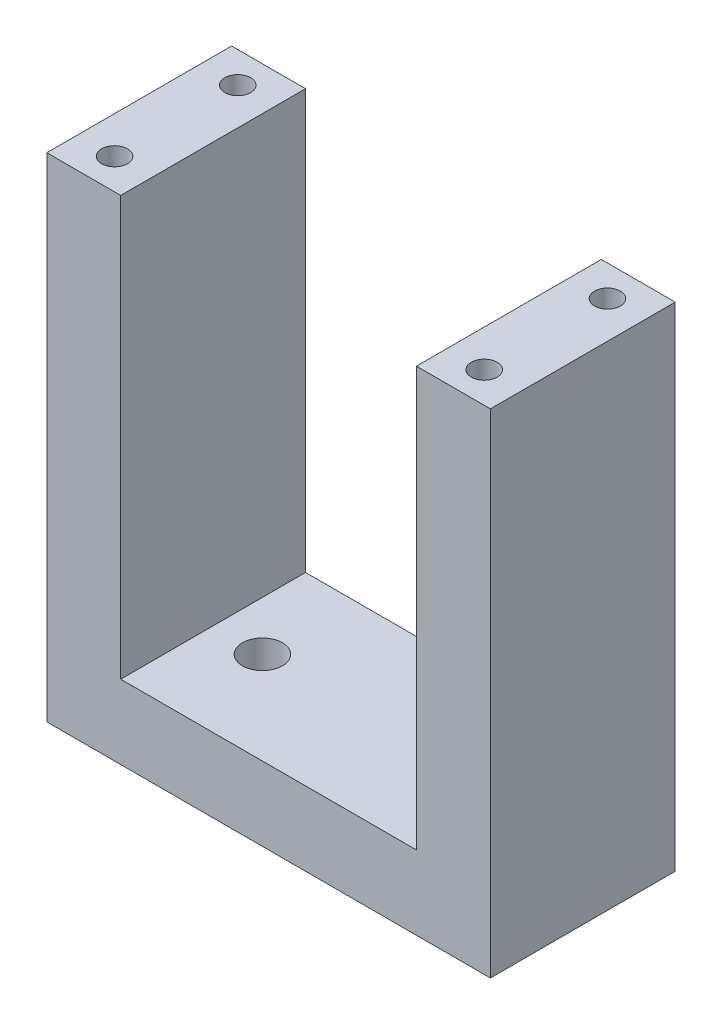
ISO-10303-21;
HEADER;
FILE_DESCRIPTION(('STEP AP214'),'2;1');
FILE_NAME('part.step','',(''),(''),'','','');
FILE_SCHEMA(('AUTOMOTIVE_DESIGN { 1 0 10303 214 1 1 1 1 }'));
ENDSEC;
DATA;
#1=APPLICATION_CONTEXT('core data for automotive mechanical design processes');
#2=APPLICATION_PROTOCOL_DEFINITION('international standard','automotive_design',2000,#1);
#3=PRODUCT_CONTEXT('',#1,'mechanical');
#4=PRODUCT('Part','Part','',(#3));
#5=PRODUCT_RELATED_PRODUCT_CATEGORY('part','',(#4));
#6=PRODUCT_DEFINITION_FORMATION('','',#4);
#7=PRODUCT_DEFINITION_CONTEXT('part definition',#1,'design');
#8=PRODUCT_DEFINITION('design','',#6,#7);
#9=PRODUCT_DEFINITION_SHAPE('','',#8);
#10=(LENGTH_UNIT() NAMED_UNIT(*) SI_UNIT(.MILLI.,.METRE.));
#11=(NAMED_UNIT(*) PLANE_ANGLE_UNIT() SI_UNIT($,.RADIAN.));
#12=(NAMED_UNIT(*) SI_UNIT($,.STERADIAN.) SOLID_ANGLE_UNIT());
#13=UNCERTAINTY_MEASURE_WITH_UNIT(LENGTH_MEASURE(1.E-05),#10,'distance_accuracy_value','');
#14=(GEOMETRIC_REPRESENTATION_CONTEXT(3) GLOBAL_UNCERTAINTY_ASSIGNED_CONTEXT((#13)) GLOBAL_UNIT_ASSIGNED_CONTEXT((#10,
#11,#12)) REPRESENTATION_CONTEXT('',''));
#15=CARTESIAN_POINT('',(0.,0.,0.));
#16=DIRECTION('',(0.,0.,1.));
#17=DIRECTION('',(1.,0.,0.));
#18=AXIS2_PLACEMENT_3D('',#15,#16,#17);
#19=CARTESIAN_POINT('',(-36.,80.,15.));
#20=DIRECTION('',(0.,-1.,0.));
#21=DIRECTION('',(0.,0.,-1.));
#22=AXIS2_PLACEMENT_3D('',#19,#20,#21);
#23=PLANE('',#22);
#24=CARTESIAN_POINT('',(-30.,80.,-10.));
#25=DIRECTION('',(0.,1.,0.));
#26=DIRECTION('',(0.,0.,1.));
#27=AXIS2_PLACEMENT_3D('',#24,#25,#26);
#28=CIRCLE('',#27,2.09999999999999);
#29=CARTESIAN_POINT('',(-30.,80.,-7.90000000000001));
#30=VERTEX_POINT('',#29);
#31=EDGE_CURVE('E197',#30,#30,#28,.T.);
#32=ORIENTED_EDGE('',*,*,#31,.F.);
#33=EDGE_LOOP('',(#32));
#34=FACE_BOUND('',#33,.T.);
#35=CARTESIAN_POINT('',(-30.,80.,10.));
#36=DIRECTION('',(0.,1.,0.));
#37=DIRECTION('',(0.,0.,1.));
#38=AXIS2_PLACEMENT_3D('',#35,#36,#37);
#39=CIRCLE('',#38,2.09999999999999);
#40=CARTESIAN_POINT('',(-30.,80.,12.1));
#41=VERTEX_POINT('',#40);
#42=EDGE_CURVE('E191',#41,#41,#39,.T.);
#43=ORIENTED_EDGE('',*,*,#42,.F.);
#44=EDGE_LOOP('',(#43));
#45=FACE_BOUND('',#44,.T.);
#46=DIRECTION('',(-1.,0.,0.));
#47=VECTOR('',#46,1.);
#48=CARTESIAN_POINT('',(-36.,80.,-15.));
#49=LINE('',#48,#47);
#50=CARTESIAN_POINT('',(-24.,80.,-15.));
#51=VERTEX_POINT('',#50);
#52=CARTESIAN_POINT('',(-36.,80.,-15.));
#53=VERTEX_POINT('',#52);
#54=EDGE_CURVE('E135',#51,#53,#49,.T.);
#55=ORIENTED_EDGE('',*,*,#54,.T.);
#56=DIRECTION('',(0.,0.,-1.));
#57=VECTOR('',#56,1.);
#58=CARTESIAN_POINT('',(-36.,80.,15.));
#59=LINE('',#58,#57);
#60=CARTESIAN_POINT('',(-36.,80.,15.));
#61=VERTEX_POINT('',#60);
#62=EDGE_CURVE('E11',#61,#53,#59,.T.);
#63=ORIENTED_EDGE('',*,*,#62,.F.);
#64=DIRECTION('',(-1.,0.,0.));
#65=VECTOR('',#64,1.);
#66=CARTESIAN_POINT('',(-36.,80.,15.));
#67=LINE('',#66,#65);
#68=CARTESIAN_POINT('',(-24.,80.,15.));
#69=VERTEX_POINT('',#68);
#70=EDGE_CURVE('E150',#69,#61,#67,.T.);
#71=ORIENTED_EDGE('',*,*,#70,.F.);
#72=DIRECTION('',(0.,0.,-1.));
#73=VECTOR('',#72,1.);
#74=CARTESIAN_POINT('',(-24.,80.,15.));
#75=LINE('',#74,#73);
#76=EDGE_CURVE('E131',#69,#51,#75,.T.);
#77=ORIENTED_EDGE('',*,*,#76,.T.);
#78=EDGE_LOOP('',(#55,#63,#71,#77));
#79=FACE_BOUND('',#78,.T.);
#80=ADVANCED_FACE('F36',(#34,#45,#79),#23,.F.);
#81=CARTESIAN_POINT('',(-36.,80.,15.));
#82=DIRECTION('',(1.,0.,0.));
#83=DIRECTION('',(0.,1.,0.));
#84=AXIS2_PLACEMENT_3D('',#81,#82,#83);
#85=PLANE('',#84);
#86=DIRECTION('',(0.,-1.,0.));
#87=VECTOR('',#86,1.);
#88=CARTESIAN_POINT('',(-36.,80.,-15.));
#89=LINE('',#88,#87);
#90=CARTESIAN_POINT('',(-36.,0.,-15.));
#91=VERTEX_POINT('',#90);
#92=EDGE_CURVE('E138',#53,#91,#89,.T.);
#93=ORIENTED_EDGE('',*,*,#92,.T.);
#94=DIRECTION('',(0.,0.,-1.));
#95=VECTOR('',#94,1.);
#96=CARTESIAN_POINT('',(-36.,0.,15.));
#97=LINE('',#96,#95);
#98=CARTESIAN_POINT('',(-36.,0.,15.));
#99=VERTEX_POINT('',#98);
#100=EDGE_CURVE('E44',#99,#91,#97,.T.);
#101=ORIENTED_EDGE('',*,*,#100,.F.);
#102=DIRECTION('',(0.,-1.,0.));
#103=VECTOR('',#102,1.);
#104=CARTESIAN_POINT('',(-36.,80.,15.));
#105=LINE('',#104,#103);
#106=EDGE_CURVE('E96',#61,#99,#105,.T.);
#107=ORIENTED_EDGE('',*,*,#106,.F.);
#108=ORIENTED_EDGE('',*,*,#62,.T.);
#109=EDGE_LOOP('',(#93,#101,#107,#108));
#110=FACE_BOUND('',#109,.T.);
#111=ADVANCED_FACE('F246',(#110),#85,.F.);
#112=CARTESIAN_POINT('',(-36.,0.,15.));
#113=DIRECTION('',(0.,1.,0.));
#114=DIRECTION('',(0.,0.,1.));
#115=AXIS2_PLACEMENT_3D('',#112,#113,#114);
#116=PLANE('',#115);
#117=CARTESIAN_POINT('',(16.,0.,0.));
#118=DIRECTION('',(0.,1.,0.));
#119=DIRECTION('',(0.,0.,1.));
#120=AXIS2_PLACEMENT_3D('',#117,#118,#119);
#121=CIRCLE('',#120,3.25);
#122=CARTESIAN_POINT('',(16.,0.,3.25));
#123=VERTEX_POINT('',#122);
#124=EDGE_CURVE('E210',#123,#123,#121,.T.);
#125=ORIENTED_EDGE('',*,*,#124,.T.);
#126=EDGE_LOOP('',(#125));
#127=FACE_BOUND('',#126,.T.);
#128=CARTESIAN_POINT('',(-16.,0.,0.));
#129=DIRECTION('',(0.,1.,0.));
#130=DIRECTION('',(0.,0.,1.));
#131=AXIS2_PLACEMENT_3D('',#128,#129,#130);
#132=CIRCLE('',#131,3.25);
#133=CARTESIAN_POINT('',(-16.,0.,3.25));
#134=VERTEX_POINT('',#133);
#135=EDGE_CURVE('E206',#134,#134,#132,.T.);
#136=ORIENTED_EDGE('',*,*,#135,.T.);
#137=EDGE_LOOP('',(#136));
#138=FACE_BOUND('',#137,.T.);
#139=DIRECTION('',(1.,0.,0.));
#140=VECTOR('',#139,1.);
#141=CARTESIAN_POINT('',(-36.,0.,-15.));
#142=LINE('',#141,#140);
#143=CARTESIAN_POINT('',(36.,0.,-15.));
#144=VERTEX_POINT('',#143);
#145=EDGE_CURVE('E141',#91,#144,#142,.T.);
#146=ORIENTED_EDGE('',*,*,#145,.T.);
#147=DIRECTION('',(0.,0.,-1.));
#148=VECTOR('',#147,1.);
#149=CARTESIAN_POINT('',(36.,0.,15.));
#150=LINE('',#149,#148);
#151=CARTESIAN_POINT('',(36.,0.,15.));
#152=VERTEX_POINT('',#151);
#153=EDGE_CURVE('E157',#152,#144,#150,.T.);
#154=ORIENTED_EDGE('',*,*,#153,.F.);
#155=DIRECTION('',(1.,0.,0.));
#156=VECTOR('',#155,1.);
#157=CARTESIAN_POINT('',(-36.,0.,15.));
#158=LINE('',#157,#156);
#159=EDGE_CURVE('E165',#99,#152,#158,.T.);
#160=ORIENTED_EDGE('',*,*,#159,.F.);
#161=ORIENTED_EDGE('',*,*,#100,.T.);
#162=EDGE_LOOP('',(#146,#154,#160,#161));
#163=FACE_BOUND('',#162,.T.);
#164=ADVANCED_FACE('F163',(#127,#138,#163),#116,.F.);
#165=CARTESIAN_POINT('',(36.,0.,15.));
#166=DIRECTION('',(-1.,0.,0.));
#167=DIRECTION('',(0.,-1.,0.));
#168=AXIS2_PLACEMENT_3D('',#165,#166,#167);
#169=PLANE('',#168);
#170=DIRECTION('',(0.,1.,0.));
#171=VECTOR('',#170,1.);
#172=CARTESIAN_POINT('',(36.,0.,-15.));
#173=LINE('',#172,#171);
#174=CARTESIAN_POINT('',(36.,80.,-15.));
#175=VERTEX_POINT('',#174);
#176=EDGE_CURVE('E143',#144,#175,#173,.T.);
#177=ORIENTED_EDGE('',*,*,#176,.T.);
#178=DIRECTION('',(0.,0.,-1.));
#179=VECTOR('',#178,1.);
#180=CARTESIAN_POINT('',(36.,80.,15.));
#181=LINE('',#180,#179);
#182=CARTESIAN_POINT('',(36.,80.,15.));
#183=VERTEX_POINT('',#182);
#184=EDGE_CURVE('E154',#183,#175,#181,.T.);
#185=ORIENTED_EDGE('',*,*,#184,.F.);
#186=DIRECTION('',(0.,1.,0.));
#187=VECTOR('',#186,1.);
#188=CARTESIAN_POINT('',(36.,0.,15.));
#189=LINE('',#188,#187);
#190=EDGE_CURVE('E177',#152,#183,#189,.T.);
#191=ORIENTED_EDGE('',*,*,#190,.F.);
#192=ORIENTED_EDGE('',*,*,#153,.T.);
#193=EDGE_LOOP('',(#177,#185,#191,#192));
#194=FACE_BOUND('',#193,.T.);
#195=ADVANCED_FACE('F173',(#194),#169,.F.);
#196=CARTESIAN_POINT('',(24.,80.,15.));
#197=DIRECTION('',(0.,-1.,0.));
#198=DIRECTION('',(0.,0.,-1.));
#199=AXIS2_PLACEMENT_3D('',#196,#197,#198);
#200=PLANE('',#199);
#201=CARTESIAN_POINT('',(30.,80.,-10.));
#202=DIRECTION('',(0.,1.,0.));
#203=DIRECTION('',(0.,0.,1.));
#204=AXIS2_PLACEMENT_3D('',#201,#202,#203);
#205=CIRCLE('',#204,2.09999999999999);
#206=CARTESIAN_POINT('',(30.,80.,-7.90000000000001));
#207=VERTEX_POINT('',#206);
#208=EDGE_CURVE('E203',#207,#207,#205,.T.);
#209=ORIENTED_EDGE('',*,*,#208,.F.);
#210=EDGE_LOOP('',(#209));
#211=FACE_BOUND('',#210,.T.);
#212=CARTESIAN_POINT('',(30.,80.,10.));
#213=DIRECTION('',(0.,1.,0.));
#214=DIRECTION('',(0.,0.,1.));
#215=AXIS2_PLACEMENT_3D('',#212,#213,#214);
#216=CIRCLE('',#215,2.09999999999999);
#217=CARTESIAN_POINT('',(30.,80.,12.1));
#218=VERTEX_POINT('',#217);
#219=EDGE_CURVE('E185',#218,#218,#216,.T.);
#220=ORIENTED_EDGE('',*,*,#219,.F.);
#221=EDGE_LOOP('',(#220));
#222=FACE_BOUND('',#221,.T.);
#223=DIRECTION('',(-1.,0.,0.));
#224=VECTOR('',#223,1.);
#225=CARTESIAN_POINT('',(24.,80.,-15.));
#226=LINE('',#225,#224);
#227=CARTESIAN_POINT('',(24.,80.,-15.));
#228=VERTEX_POINT('',#227);
#229=EDGE_CURVE('E145',#175,#228,#226,.T.);
#230=ORIENTED_EDGE('',*,*,#229,.T.);
#231=DIRECTION('',(0.,0.,-1.));
#232=VECTOR('',#231,1.);
#233=CARTESIAN_POINT('',(24.,80.,15.));
#234=LINE('',#233,#232);
#235=CARTESIAN_POINT('',(24.,80.,15.));
#236=VERTEX_POINT('',#235);
#237=EDGE_CURVE('E126',#236,#228,#234,.T.);
#238=ORIENTED_EDGE('',*,*,#237,.F.);
#239=DIRECTION('',(-1.,0.,0.));
#240=VECTOR('',#239,1.);
#241=CARTESIAN_POINT('',(24.,80.,15.));
#242=LINE('',#241,#240);
#243=EDGE_CURVE('E117',#183,#236,#242,.T.);
#244=ORIENTED_EDGE('',*,*,#243,.F.);
#245=ORIENTED_EDGE('',*,*,#184,.T.);
#246=EDGE_LOOP('',(#230,#238,#244,#245));
#247=FACE_BOUND('',#246,.T.);
#248=ADVANCED_FACE('F176',(#211,#222,#247),#200,.F.);
#249=CARTESIAN_POINT('',(24.,12.,15.));
#250=DIRECTION('',(1.,0.,0.));
#251=DIRECTION('',(0.,0.,-1.));
#252=AXIS2_PLACEMENT_3D('',#249,#250,#251);
#253=PLANE('',#252);
#254=DIRECTION('',(0.,-1.,0.));
#255=VECTOR('',#254,1.);
#256=CARTESIAN_POINT('',(24.,12.,-15.));
#257=LINE('',#256,#255);
#258=CARTESIAN_POINT('',(24.,12.,-15.));
#259=VERTEX_POINT('',#258);
#260=EDGE_CURVE('E125',#228,#259,#257,.T.);
#261=ORIENTED_EDGE('',*,*,#260,.T.);
#262=DIRECTION('',(0.,0.,-1.));
#263=VECTOR('',#262,1.);
#264=CARTESIAN_POINT('',(24.,12.,15.));
#265=LINE('',#264,#263);
#266=CARTESIAN_POINT('',(24.,12.,15.));
#267=VERTEX_POINT('',#266);
#268=EDGE_CURVE('E122',#267,#259,#265,.T.);
#269=ORIENTED_EDGE('',*,*,#268,.F.);
#270=DIRECTION('',(0.,-1.,0.));
#271=VECTOR('',#270,1.);
#272=CARTESIAN_POINT('',(24.,12.,15.));
#273=LINE('',#272,#271);
#274=EDGE_CURVE('E111',#236,#267,#273,.T.);
#275=ORIENTED_EDGE('',*,*,#274,.F.);
#276=ORIENTED_EDGE('',*,*,#237,.T.);
#277=EDGE_LOOP('',(#261,#269,#275,#276));
#278=FACE_BOUND('',#277,.T.);
#279=ADVANCED_FACE('F123',(#278),#253,.F.);
#280=CARTESIAN_POINT('',(-24.,12.,15.));
#281=DIRECTION('',(0.,-1.,0.));
#282=DIRECTION('',(0.,0.,-1.));
#283=AXIS2_PLACEMENT_3D('',#280,#281,#282);
#284=PLANE('',#283);
#285=CARTESIAN_POINT('',(16.,12.,0.));
#286=DIRECTION('',(0.,1.,0.));
#287=DIRECTION('',(0.,0.,1.));
#288=AXIS2_PLACEMENT_3D('',#285,#286,#287);
#289=CIRCLE('',#288,3.25);
#290=CARTESIAN_POINT('',(16.,12.,3.25));
#291=VERTEX_POINT('',#290);
#292=EDGE_CURVE('E213',#291,#291,#289,.T.);
#293=ORIENTED_EDGE('',*,*,#292,.F.);
#294=EDGE_LOOP('',(#293));
#295=FACE_BOUND('',#294,.T.);
#296=CARTESIAN_POINT('',(-16.,12.,0.));
#297=DIRECTION('',(0.,1.,0.));
#298=DIRECTION('',(0.,0.,1.));
#299=AXIS2_PLACEMENT_3D('',#296,#297,#298);
#300=CIRCLE('',#299,3.25);
#301=CARTESIAN_POINT('',(-16.,12.,3.25));
#302=VERTEX_POINT('',#301);
#303=EDGE_CURVE('E207',#302,#302,#300,.T.);
#304=ORIENTED_EDGE('',*,*,#303,.F.);
#305=EDGE_LOOP('',(#304));
#306=FACE_BOUND('',#305,.T.);
#307=DIRECTION('',(-1.,0.,0.));
#308=VECTOR('',#307,1.);
#309=CARTESIAN_POINT('',(-24.,12.,-15.));
#310=LINE('',#309,#308);
#311=CARTESIAN_POINT('',(-24.,12.,-15.));
#312=VERTEX_POINT('',#311);
#313=EDGE_CURVE('E82',#259,#312,#310,.T.);
#314=ORIENTED_EDGE('',*,*,#313,.T.);
#315=DIRECTION('',(0.,0.,-1.));
#316=VECTOR('',#315,1.);
#317=CARTESIAN_POINT('',(-24.,12.,15.));
#318=LINE('',#317,#316);
#319=CARTESIAN_POINT('',(-24.,12.,15.));
#320=VERTEX_POINT('',#319);
#321=EDGE_CURVE('E127',#320,#312,#318,.T.);
#322=ORIENTED_EDGE('',*,*,#321,.F.);
#323=DIRECTION('',(-1.,0.,0.));
#324=VECTOR('',#323,1.);
#325=CARTESIAN_POINT('',(-24.,12.,15.));
#326=LINE('',#325,#324);
#327=EDGE_CURVE('E115',#267,#320,#326,.T.);
#328=ORIENTED_EDGE('',*,*,#327,.F.);
#329=ORIENTED_EDGE('',*,*,#268,.T.);
#330=EDGE_LOOP('',(#314,#322,#328,#329));
#331=FACE_BOUND('',#330,.T.);
#332=ADVANCED_FACE('F129',(#295,#306,#331),#284,.F.);
#333=CARTESIAN_POINT('',(-24.,80.,15.));
#334=DIRECTION('',(-1.,0.,0.));
#335=DIRECTION('',(0.,-1.,0.));
#336=AXIS2_PLACEMENT_3D('',#333,#334,#335);
#337=PLANE('',#336);
#338=DIRECTION('',(0.,1.,0.));
#339=VECTOR('',#338,1.);
#340=CARTESIAN_POINT('',(-24.,80.,-15.));
#341=LINE('',#340,#339);
#342=EDGE_CURVE('E88',#312,#51,#341,.T.);
#343=ORIENTED_EDGE('',*,*,#342,.T.);
#344=ORIENTED_EDGE('',*,*,#76,.F.);
#345=DIRECTION('',(0.,1.,0.));
#346=VECTOR('',#345,1.);
#347=CARTESIAN_POINT('',(-24.,80.,15.));
#348=LINE('',#347,#346);
#349=EDGE_CURVE('E52',#320,#69,#348,.T.);
#350=ORIENTED_EDGE('',*,*,#349,.F.);
#351=ORIENTED_EDGE('',*,*,#321,.T.);
#352=EDGE_LOOP('',(#343,#344,#350,#351));
#353=FACE_BOUND('',#352,.T.);
#354=ADVANCED_FACE('F230',(#353),#337,.F.);
#355=CARTESIAN_POINT('',(-24.,80.,15.));
#356=DIRECTION('',(0.,0.,-1.));
#357=DIRECTION('',(-1.,0.,0.));
#358=AXIS2_PLACEMENT_3D('',#355,#356,#357);
#359=PLANE('',#358);
#360=ORIENTED_EDGE('',*,*,#70,.T.);
#361=ORIENTED_EDGE('',*,*,#106,.T.);
#362=ORIENTED_EDGE('',*,*,#159,.T.);
#363=ORIENTED_EDGE('',*,*,#190,.T.);
#364=ORIENTED_EDGE('',*,*,#243,.T.);
#365=ORIENTED_EDGE('',*,*,#274,.T.);
#366=ORIENTED_EDGE('',*,*,#327,.T.);
#367=ORIENTED_EDGE('',*,*,#349,.T.);
#368=EDGE_LOOP('',(#360,#361,#362,#363,#364,#365,#366,#367));
#369=FACE_BOUND('',#368,.T.);
#370=ADVANCED_FACE('F113',(#369),#359,.F.);
#371=CARTESIAN_POINT('',(-24.,80.,-15.));
#372=DIRECTION('',(0.,0.,-1.));
#373=DIRECTION('',(-1.,0.,0.));
#374=AXIS2_PLACEMENT_3D('',#371,#372,#373);
#375=PLANE('',#374);
#376=ORIENTED_EDGE('',*,*,#54,.F.);
#377=ORIENTED_EDGE('',*,*,#342,.F.);
#378=ORIENTED_EDGE('',*,*,#313,.F.);
#379=ORIENTED_EDGE('',*,*,#260,.F.);
#380=ORIENTED_EDGE('',*,*,#229,.F.);
#381=ORIENTED_EDGE('',*,*,#176,.F.);
#382=ORIENTED_EDGE('',*,*,#145,.F.);
#383=ORIENTED_EDGE('',*,*,#92,.F.);
#384=EDGE_LOOP('',(#376,#377,#378,#379,#380,#381,#382,#383));
#385=FACE_BOUND('',#384,.T.);
#386=ADVANCED_FACE('F169',(#385),#375,.T.);
#387=CARTESIAN_POINT('',(30.,67.6,10.));
#388=DIRECTION('',(0.,1.,0.));
#389=DIRECTION('',(0.,0.,1.));
#390=AXIS2_PLACEMENT_3D('',#387,#388,#389);
#391=CONICAL_SURFACE('',#390,2.09999999999999,1.02974425867665);
#392=CARTESIAN_POINT('',(30.,66.3381927000421,10.));
#393=VERTEX_POINT('',#392);
#394=VERTEX_LOOP('',#393);
#395=FACE_BOUND('',#394,.T.);
#396=CARTESIAN_POINT('',(30.,67.6,10.));
#397=DIRECTION('',(0.,1.,0.));
#398=DIRECTION('',(0.,0.,1.));
#399=AXIS2_PLACEMENT_3D('',#396,#397,#398);
#400=CIRCLE('',#399,2.09999999999999);
#401=CARTESIAN_POINT('',(30.,67.6,12.1));
#402=VERTEX_POINT('',#401);
#403=EDGE_CURVE('E139',#402,#402,#400,.T.);
#404=ORIENTED_EDGE('',*,*,#403,.T.);
#405=EDGE_LOOP('',(#404));
#406=FACE_BOUND('',#405,.T.);
#407=ADVANCED_FACE('F368',(#395,#406),#391,.F.);
#408=CARTESIAN_POINT('',(30.,80.,10.));
#409=DIRECTION('',(0.,1.,0.));
#410=DIRECTION('',(0.,0.,1.));
#411=AXIS2_PLACEMENT_3D('',#408,#409,#410);
#412=CYLINDRICAL_SURFACE('',#411,2.09999999999999);
#413=ORIENTED_EDGE('',*,*,#403,.F.);
#414=EDGE_LOOP('',(#413));
#415=FACE_BOUND('',#414,.T.);
#416=ORIENTED_EDGE('',*,*,#219,.T.);
#417=EDGE_LOOP('',(#416));
#418=FACE_BOUND('',#417,.T.);
#419=ADVANCED_FACE('F359',(#415,#418),#412,.F.);
#420=CARTESIAN_POINT('',(-30.,67.6,10.));
#421=DIRECTION('',(0.,1.,0.));
#422=DIRECTION('',(0.,0.,1.));
#423=AXIS2_PLACEMENT_3D('',#420,#421,#422);
#424=CONICAL_SURFACE('',#423,2.09999999999999,1.02974425867665);
#425=CARTESIAN_POINT('',(-30.,66.3381927000421,10.));
#426=VERTEX_POINT('',#425);
#427=VERTEX_LOOP('',#426);
#428=FACE_BOUND('',#427,.T.);
#429=CARTESIAN_POINT('',(-30.,67.6,10.));
#430=DIRECTION('',(0.,1.,0.));
#431=DIRECTION('',(0.,0.,1.));
#432=AXIS2_PLACEMENT_3D('',#429,#430,#431);
#433=CIRCLE('',#432,2.09999999999999);
#434=CARTESIAN_POINT('',(-30.,67.6,12.1));
#435=VERTEX_POINT('',#434);
#436=EDGE_CURVE('E188',#435,#435,#433,.T.);
#437=ORIENTED_EDGE('',*,*,#436,.T.);
#438=EDGE_LOOP('',(#437));
#439=FACE_BOUND('',#438,.T.);
#440=ADVANCED_FACE('F349',(#428,#439),#424,.F.);
#441=CARTESIAN_POINT('',(-30.,80.,10.));
#442=DIRECTION('',(0.,1.,0.));
#443=DIRECTION('',(0.,0.,1.));
#444=AXIS2_PLACEMENT_3D('',#441,#442,#443);
#445=CYLINDRICAL_SURFACE('',#444,2.09999999999999);
#446=ORIENTED_EDGE('',*,*,#436,.F.);
#447=EDGE_LOOP('',(#446));
#448=FACE_BOUND('',#447,.T.);
#449=ORIENTED_EDGE('',*,*,#42,.T.);
#450=EDGE_LOOP('',(#449));
#451=FACE_BOUND('',#450,.T.);
#452=ADVANCED_FACE('F340',(#448,#451),#445,.F.);
#453=CARTESIAN_POINT('',(-30.,67.6,-10.));
#454=DIRECTION('',(0.,1.,0.));
#455=DIRECTION('',(0.,0.,1.));
#456=AXIS2_PLACEMENT_3D('',#453,#454,#455);
#457=CONICAL_SURFACE('',#456,2.09999999999999,1.02974425867665);
#458=CARTESIAN_POINT('',(-30.,66.3381927000421,-10.));
#459=VERTEX_POINT('',#458);
#460=VERTEX_LOOP('',#459);
#461=FACE_BOUND('',#460,.T.);
#462=CARTESIAN_POINT('',(-30.,67.6,-10.));
#463=DIRECTION('',(0.,1.,0.));
#464=DIRECTION('',(0.,0.,1.));
#465=AXIS2_PLACEMENT_3D('',#462,#463,#464);
#466=CIRCLE('',#465,2.09999999999999);
#467=CARTESIAN_POINT('',(-30.,67.6,-7.90000000000001));
#468=VERTEX_POINT('',#467);
#469=EDGE_CURVE('E194',#468,#468,#466,.T.);
#470=ORIENTED_EDGE('',*,*,#469,.T.);
#471=EDGE_LOOP('',(#470));
#472=FACE_BOUND('',#471,.T.);
#473=ADVANCED_FACE('F330',(#461,#472),#457,.F.);
#474=CARTESIAN_POINT('',(-30.,80.,-10.));
#475=DIRECTION('',(0.,1.,0.));
#476=DIRECTION('',(0.,0.,1.));
#477=AXIS2_PLACEMENT_3D('',#474,#475,#476);
#478=CYLINDRICAL_SURFACE('',#477,2.09999999999999);
#479=ORIENTED_EDGE('',*,*,#469,.F.);
#480=EDGE_LOOP('',(#479));
#481=FACE_BOUND('',#480,.T.);
#482=ORIENTED_EDGE('',*,*,#31,.T.);
#483=EDGE_LOOP('',(#482));
#484=FACE_BOUND('',#483,.T.);
#485=ADVANCED_FACE('F321',(#481,#484),#478,.F.);
#486=CARTESIAN_POINT('',(30.,67.6,-10.));
#487=DIRECTION('',(0.,1.,0.));
#488=DIRECTION('',(0.,0.,1.));
#489=AXIS2_PLACEMENT_3D('',#486,#487,#488);
#490=CONICAL_SURFACE('',#489,2.09999999999999,1.02974425867665);
#491=CARTESIAN_POINT('',(30.,66.3381927000421,-10.));
#492=VERTEX_POINT('',#491);
#493=VERTEX_LOOP('',#492);
#494=FACE_BOUND('',#493,.T.);
#495=CARTESIAN_POINT('',(30.,67.6,-10.));
#496=DIRECTION('',(0.,1.,0.));
#497=DIRECTION('',(0.,0.,1.));
#498=AXIS2_PLACEMENT_3D('',#495,#496,#497);
#499=CIRCLE('',#498,2.09999999999999);
#500=CARTESIAN_POINT('',(30.,67.6,-7.90000000000001));
#501=VERTEX_POINT('',#500);
#502=EDGE_CURVE('E200',#501,#501,#499,.T.);
#503=ORIENTED_EDGE('',*,*,#502,.T.);
#504=EDGE_LOOP('',(#503));
#505=FACE_BOUND('',#504,.T.);
#506=ADVANCED_FACE('F241',(#494,#505),#490,.F.);
#507=CARTESIAN_POINT('',(30.,80.,-10.));
#508=DIRECTION('',(0.,1.,0.));
#509=DIRECTION('',(0.,0.,1.));
#510=AXIS2_PLACEMENT_3D('',#507,#508,#509);
#511=CYLINDRICAL_SURFACE('',#510,2.09999999999999);
#512=ORIENTED_EDGE('',*,*,#502,.F.);
#513=EDGE_LOOP('',(#512));
#514=FACE_BOUND('',#513,.T.);
#515=ORIENTED_EDGE('',*,*,#208,.T.);
#516=EDGE_LOOP('',(#515));
#517=FACE_BOUND('',#516,.T.);
#518=ADVANCED_FACE('F235',(#514,#517),#511,.F.);
#519=CARTESIAN_POINT('',(-16.,0.,0.));
#520=DIRECTION('',(0.,1.,0.));
#521=DIRECTION('',(0.,0.,1.));
#522=AXIS2_PLACEMENT_3D('',#519,#520,#521);
#523=CYLINDRICAL_SURFACE('',#522,3.25);
#524=ORIENTED_EDGE('',*,*,#135,.F.);
#525=EDGE_LOOP('',(#524));
#526=FACE_BOUND('',#525,.T.);
#527=ORIENTED_EDGE('',*,*,#303,.T.);
#528=EDGE_LOOP('',(#527));
#529=FACE_BOUND('',#528,.T.);
#530=ADVANCED_FACE('F224',(#526,#529),#523,.F.);
#531=CARTESIAN_POINT('',(16.,0.,0.));
#532=DIRECTION('',(0.,1.,0.));
#533=DIRECTION('',(0.,0.,1.));
#534=AXIS2_PLACEMENT_3D('',#531,#532,#533);
#535=CYLINDRICAL_SURFACE('',#534,3.25);
#536=ORIENTED_EDGE('',*,*,#124,.F.);
#537=EDGE_LOOP('',(#536));
#538=FACE_BOUND('',#537,.T.);
#539=ORIENTED_EDGE('',*,*,#292,.T.);
#540=EDGE_LOOP('',(#539));
#541=FACE_BOUND('',#540,.T.);
#542=ADVANCED_FACE('F221',(#538,#541),#535,.F.);
#543=CLOSED_SHELL('',(#80,#111,#164,#195,#248,#279,#332,#354,#370,#386,#407,#419,#440,#452,#473,
#485,#506,#518,#530,#542));
#544=MANIFOLD_SOLID_BREP('B2',#543);
#545=ADVANCED_BREP_SHAPE_REPRESENTATION('',(#18,#544),#14);
#546=SHAPE_DEFINITION_REPRESENTATION(#9,#545);
ENDSEC;
END-ISO-10303-21;
